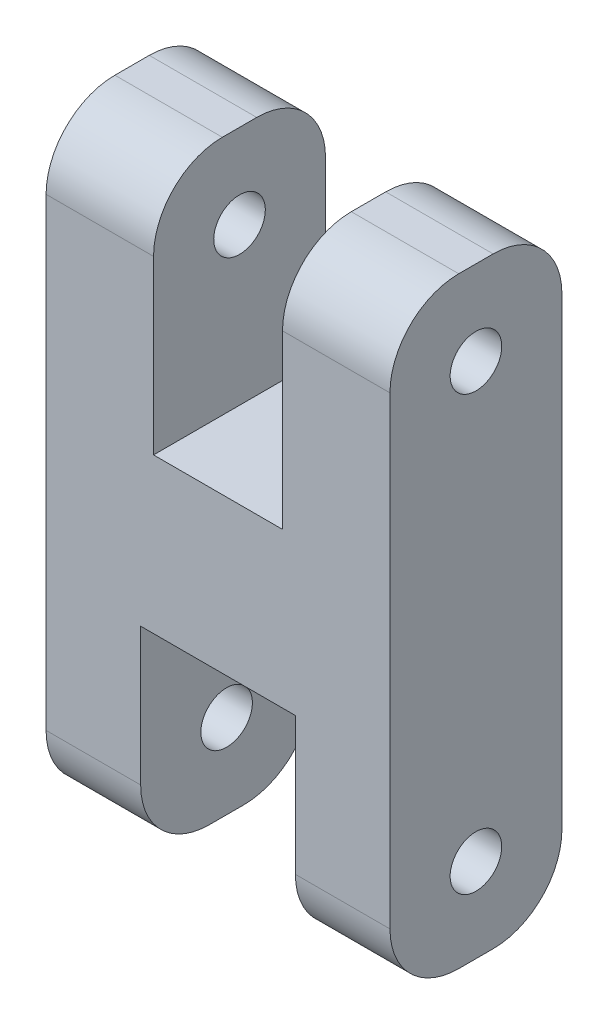
ISO-10303-21;
HEADER;
FILE_DESCRIPTION(('STEP AP214'),'2;1');
FILE_NAME('part.step','',(''),(''),'','','');
FILE_SCHEMA(('AUTOMOTIVE_DESIGN { 1 0 10303 214 1 1 1 1 }'));
ENDSEC;
DATA;
#1=APPLICATION_CONTEXT('core data for automotive mechanical design processes');
#2=APPLICATION_PROTOCOL_DEFINITION('international standard','automotive_design',2000,#1);
#3=PRODUCT_CONTEXT('',#1,'mechanical');
#4=PRODUCT('Part','Part','',(#3));
#5=PRODUCT_RELATED_PRODUCT_CATEGORY('part','',(#4));
#6=PRODUCT_DEFINITION_FORMATION('','',#4);
#7=PRODUCT_DEFINITION_CONTEXT('part definition',#1,'design');
#8=PRODUCT_DEFINITION('design','',#6,#7);
#9=PRODUCT_DEFINITION_SHAPE('','',#8);
#10=(LENGTH_UNIT() NAMED_UNIT(*) SI_UNIT(.MILLI.,.METRE.));
#11=(NAMED_UNIT(*) PLANE_ANGLE_UNIT() SI_UNIT($,.RADIAN.));
#12=(NAMED_UNIT(*) SI_UNIT($,.STERADIAN.) SOLID_ANGLE_UNIT());
#13=UNCERTAINTY_MEASURE_WITH_UNIT(LENGTH_MEASURE(1.E-05),#10,'distance_accuracy_value','');
#14=(GEOMETRIC_REPRESENTATION_CONTEXT(3) GLOBAL_UNCERTAINTY_ASSIGNED_CONTEXT((#13)) GLOBAL_UNIT_ASSIGNED_CONTEXT((#10,
#11,#12)) REPRESENTATION_CONTEXT('',''));
#15=CARTESIAN_POINT('',(0.,0.,0.));
#16=DIRECTION('',(0.,0.,1.));
#17=DIRECTION('',(1.,0.,0.));
#18=AXIS2_PLACEMENT_3D('',#15,#16,#17);
#19=CARTESIAN_POINT('',(10.,-13.5,1.));
#20=DIRECTION('',(-1.,0.,0.));
#21=DIRECTION('',(0.,0.,1.));
#22=AXIS2_PLACEMENT_3D('',#19,#20,#21);
#23=CYLINDRICAL_SURFACE('',#22,4.);
#24=DIRECTION('',(-1.,0.,0.));
#25=VECTOR('',#24,1.);
#26=CARTESIAN_POINT('',(10.,-17.5,1.));
#27=LINE('',#26,#25);
#28=CARTESIAN_POINT('',(-4.49999999999999,-17.5,1.));
#29=VERTEX_POINT('',#28);
#30=CARTESIAN_POINT('',(-10.,-17.5,1.));
#31=VERTEX_POINT('',#30);
#32=EDGE_CURVE('E42',#29,#31,#27,.T.);
#33=ORIENTED_EDGE('',*,*,#32,.F.);
#34=CARTESIAN_POINT('',(-4.49999999999999,-13.5,1.));
#35=DIRECTION('',(-1.,0.,0.));
#36=DIRECTION('',(0.,0.,1.));
#37=AXIS2_PLACEMENT_3D('',#34,#35,#36);
#38=CIRCLE('',#37,4.);
#39=CARTESIAN_POINT('',(-4.49999999999999,-13.5,5.));
#40=VERTEX_POINT('',#39);
#41=EDGE_CURVE('E241',#29,#40,#38,.T.);
#42=ORIENTED_EDGE('',*,*,#41,.T.);
#43=DIRECTION('',(-1.,0.,0.));
#44=VECTOR('',#43,1.);
#45=CARTESIAN_POINT('',(10.,-13.5,5.));
#46=LINE('',#45,#44);
#47=CARTESIAN_POINT('',(-10.,-13.5,5.));
#48=VERTEX_POINT('',#47);
#49=EDGE_CURVE('E286',#40,#48,#46,.T.);
#50=ORIENTED_EDGE('',*,*,#49,.T.);
#51=CARTESIAN_POINT('',(-10.,-13.5,1.));
#52=DIRECTION('',(1.,0.,0.));
#53=DIRECTION('',(0.,0.,-1.));
#54=AXIS2_PLACEMENT_3D('',#51,#52,#53);
#55=CIRCLE('',#54,4.);
#56=EDGE_CURVE('E265',#48,#31,#55,.T.);
#57=ORIENTED_EDGE('',*,*,#56,.T.);
#58=EDGE_LOOP('',(#33,#42,#50,#57));
#59=FACE_BOUND('',#58,.T.);
#60=ADVANCED_FACE('F33',(#59),#23,.T.);
#61=CARTESIAN_POINT('',(10.,-17.5,1.));
#62=DIRECTION('',(0.,1.,0.));
#63=DIRECTION('',(0.,0.,1.));
#64=AXIS2_PLACEMENT_3D('',#61,#62,#63);
#65=PLANE('',#64);
#66=DIRECTION('',(-1.,0.,0.));
#67=VECTOR('',#66,1.);
#68=CARTESIAN_POINT('',(10.,-17.5,-0.999999999999998));
#69=LINE('',#68,#67);
#70=CARTESIAN_POINT('',(-4.49999999999999,-17.5,-0.999999999999999));
#71=VERTEX_POINT('',#70);
#72=CARTESIAN_POINT('',(-10.,-17.5,-0.999999999999998));
#73=VERTEX_POINT('',#72);
#74=EDGE_CURVE('E331',#71,#73,#69,.T.);
#75=ORIENTED_EDGE('',*,*,#74,.F.);
#76=DIRECTION('',(0.,0.,1.));
#77=VECTOR('',#76,1.);
#78=CARTESIAN_POINT('',(-4.49999999999999,-17.5,-5.));
#79=LINE('',#78,#77);
#80=EDGE_CURVE('E224',#71,#29,#79,.T.);
#81=ORIENTED_EDGE('',*,*,#80,.T.);
#82=ORIENTED_EDGE('',*,*,#32,.T.);
#83=DIRECTION('',(0.,0.,-1.));
#84=VECTOR('',#83,1.);
#85=CARTESIAN_POINT('',(-10.,-17.5,1.));
#86=LINE('',#85,#84);
#87=EDGE_CURVE('E289',#31,#73,#86,.T.);
#88=ORIENTED_EDGE('',*,*,#87,.T.);
#89=EDGE_LOOP('',(#75,#81,#82,#88));
#90=FACE_BOUND('',#89,.T.);
#91=ADVANCED_FACE('F376',(#90),#65,.F.);
#92=CARTESIAN_POINT('',(10.,-13.5,-0.999999999999999));
#93=DIRECTION('',(-1.,0.,0.));
#94=DIRECTION('',(0.,0.,1.));
#95=AXIS2_PLACEMENT_3D('',#92,#93,#94);
#96=CYLINDRICAL_SURFACE('',#95,4.);
#97=DIRECTION('',(-1.,0.,0.));
#98=VECTOR('',#97,1.);
#99=CARTESIAN_POINT('',(10.,-13.5,-5.));
#100=LINE('',#99,#98);
#101=CARTESIAN_POINT('',(-4.49999999999999,-13.5,-5.));
#102=VERTEX_POINT('',#101);
#103=CARTESIAN_POINT('',(-10.,-13.5,-5.));
#104=VERTEX_POINT('',#103);
#105=EDGE_CURVE('E327',#102,#104,#100,.T.);
#106=ORIENTED_EDGE('',*,*,#105,.F.);
#107=CARTESIAN_POINT('',(-4.49999999999999,-13.5,-0.999999999999999));
#108=DIRECTION('',(-1.,0.,0.));
#109=DIRECTION('',(0.,0.,1.));
#110=AXIS2_PLACEMENT_3D('',#107,#108,#109);
#111=CIRCLE('',#110,4.);
#112=EDGE_CURVE('E238',#102,#71,#111,.T.);
#113=ORIENTED_EDGE('',*,*,#112,.T.);
#114=ORIENTED_EDGE('',*,*,#74,.T.);
#115=CARTESIAN_POINT('',(-10.,-13.5,-0.999999999999999));
#116=DIRECTION('',(1.,0.,0.));
#117=DIRECTION('',(0.,0.,-1.));
#118=AXIS2_PLACEMENT_3D('',#115,#116,#117);
#119=CIRCLE('',#118,4.);
#120=EDGE_CURVE('E292',#73,#104,#119,.T.);
#121=ORIENTED_EDGE('',*,*,#120,.T.);
#122=EDGE_LOOP('',(#106,#113,#114,#121));
#123=FACE_BOUND('',#122,.T.);
#124=ADVANCED_FACE('F381',(#123),#96,.T.);
#125=CARTESIAN_POINT('',(10.,13.5,-0.999999999999999));
#126=DIRECTION('',(-1.,0.,0.));
#127=DIRECTION('',(0.,0.,1.));
#128=AXIS2_PLACEMENT_3D('',#125,#126,#127);
#129=CYLINDRICAL_SURFACE('',#128,4.);
#130=DIRECTION('',(-1.,0.,0.));
#131=VECTOR('',#130,1.);
#132=CARTESIAN_POINT('',(10.,13.5,-5.));
#133=LINE('',#132,#131);
#134=CARTESIAN_POINT('',(10.,13.5,-5.));
#135=VERTEX_POINT('',#134);
#136=CARTESIAN_POINT('',(3.75,13.5,-5.));
#137=VERTEX_POINT('',#136);
#138=EDGE_CURVE('E324',#135,#137,#133,.T.);
#139=ORIENTED_EDGE('',*,*,#138,.T.);
#140=CARTESIAN_POINT('',(3.75,13.5,-0.999999999999999));
#141=DIRECTION('',(1.,0.,0.));
#142=DIRECTION('',(0.,1.,0.));
#143=AXIS2_PLACEMENT_3D('',#140,#141,#142);
#144=CIRCLE('',#143,4.);
#145=CARTESIAN_POINT('',(3.75,17.5,-0.999999999999998));
#146=VERTEX_POINT('',#145);
#147=EDGE_CURVE('E252',#137,#146,#144,.T.);
#148=ORIENTED_EDGE('',*,*,#147,.T.);
#149=DIRECTION('',(-1.,0.,0.));
#150=VECTOR('',#149,1.);
#151=CARTESIAN_POINT('',(10.,17.5,-0.999999999999999));
#152=LINE('',#151,#150);
#153=CARTESIAN_POINT('',(10.,17.5,-0.999999999999999));
#154=VERTEX_POINT('',#153);
#155=EDGE_CURVE('E320',#154,#146,#152,.T.);
#156=ORIENTED_EDGE('',*,*,#155,.F.);
#157=CARTESIAN_POINT('',(10.,13.5,-0.999999999999999));
#158=DIRECTION('',(1.,0.,0.));
#159=DIRECTION('',(0.,0.,1.));
#160=AXIS2_PLACEMENT_3D('',#157,#158,#159);
#161=CIRCLE('',#160,4.);
#162=EDGE_CURVE('E278',#135,#154,#161,.T.);
#163=ORIENTED_EDGE('',*,*,#162,.F.);
#164=EDGE_LOOP('',(#139,#148,#156,#163));
#165=FACE_BOUND('',#164,.T.);
#166=ADVANCED_FACE('F426',(#165),#129,.T.);
#167=CARTESIAN_POINT('',(10.,17.5,1.));
#168=DIRECTION('',(0.,-1.,0.));
#169=DIRECTION('',(0.,0.,-1.));
#170=AXIS2_PLACEMENT_3D('',#167,#168,#169);
#171=PLANE('',#170);
#172=ORIENTED_EDGE('',*,*,#155,.T.);
#173=DIRECTION('',(0.,0.,1.));
#174=VECTOR('',#173,1.);
#175=CARTESIAN_POINT('',(3.75,17.5,-5.));
#176=LINE('',#175,#174);
#177=CARTESIAN_POINT('',(3.75,17.5,1.));
#178=VERTEX_POINT('',#177);
#179=EDGE_CURVE('E202',#146,#178,#176,.T.);
#180=ORIENTED_EDGE('',*,*,#179,.T.);
#181=DIRECTION('',(-1.,0.,0.));
#182=VECTOR('',#181,1.);
#183=CARTESIAN_POINT('',(10.,17.5,1.));
#184=LINE('',#183,#182);
#185=CARTESIAN_POINT('',(10.,17.5,1.));
#186=VERTEX_POINT('',#185);
#187=EDGE_CURVE('E316',#186,#178,#184,.T.);
#188=ORIENTED_EDGE('',*,*,#187,.F.);
#189=DIRECTION('',(0.,0.,1.));
#190=VECTOR('',#189,1.);
#191=CARTESIAN_POINT('',(10.,17.5,1.));
#192=LINE('',#191,#190);
#193=EDGE_CURVE('E280',#154,#186,#192,.T.);
#194=ORIENTED_EDGE('',*,*,#193,.F.);
#195=EDGE_LOOP('',(#172,#180,#188,#194));
#196=FACE_BOUND('',#195,.T.);
#197=ADVANCED_FACE('F422',(#196),#171,.F.);
#198=CARTESIAN_POINT('',(10.,13.5,1.));
#199=DIRECTION('',(-1.,0.,0.));
#200=DIRECTION('',(0.,0.,1.));
#201=AXIS2_PLACEMENT_3D('',#198,#199,#200);
#202=CYLINDRICAL_SURFACE('',#201,4.);
#203=ORIENTED_EDGE('',*,*,#187,.T.);
#204=CARTESIAN_POINT('',(3.75,13.5,1.));
#205=DIRECTION('',(1.,0.,0.));
#206=DIRECTION('',(0.,1.,0.));
#207=AXIS2_PLACEMENT_3D('',#204,#205,#206);
#208=CIRCLE('',#207,4.);
#209=CARTESIAN_POINT('',(3.75,13.5,5.));
#210=VERTEX_POINT('',#209);
#211=EDGE_CURVE('E249',#178,#210,#208,.T.);
#212=ORIENTED_EDGE('',*,*,#211,.T.);
#213=DIRECTION('',(-1.,0.,0.));
#214=VECTOR('',#213,1.);
#215=CARTESIAN_POINT('',(10.,13.5,5.));
#216=LINE('',#215,#214);
#217=CARTESIAN_POINT('',(10.,13.5,5.));
#218=VERTEX_POINT('',#217);
#219=EDGE_CURVE('E313',#218,#210,#216,.T.);
#220=ORIENTED_EDGE('',*,*,#219,.F.);
#221=CARTESIAN_POINT('',(10.,13.5,1.));
#222=DIRECTION('',(1.,0.,0.));
#223=DIRECTION('',(0.,0.,-1.));
#224=AXIS2_PLACEMENT_3D('',#221,#222,#223);
#225=CIRCLE('',#224,4.);
#226=EDGE_CURVE('E282',#186,#218,#225,.T.);
#227=ORIENTED_EDGE('',*,*,#226,.F.);
#228=EDGE_LOOP('',(#203,#212,#220,#227));
#229=FACE_BOUND('',#228,.T.);
#230=ADVANCED_FACE('F368',(#229),#202,.T.);
#231=CARTESIAN_POINT('',(10.,12.6,0.));
#232=DIRECTION('',(-1.,0.,0.));
#233=DIRECTION('',(0.,0.,1.));
#234=AXIS2_PLACEMENT_3D('',#231,#232,#233);
#235=CYLINDRICAL_SURFACE('',#234,1.5);
#236=CARTESIAN_POINT('',(3.75,12.6,0.));
#237=DIRECTION('',(1.,0.,0.));
#238=DIRECTION('',(0.,1.,0.));
#239=AXIS2_PLACEMENT_3D('',#236,#237,#238);
#240=CIRCLE('',#239,1.5);
#241=CARTESIAN_POINT('',(3.75,14.1,0.));
#242=VERTEX_POINT('',#241);
#243=EDGE_CURVE('E37',#242,#242,#240,.T.);
#244=ORIENTED_EDGE('',*,*,#243,.F.);
#245=EDGE_LOOP('',(#244));
#246=FACE_BOUND('',#245,.T.);
#247=CARTESIAN_POINT('',(10.,12.6,0.));
#248=DIRECTION('',(1.,0.,0.));
#249=DIRECTION('',(0.,0.,-1.));
#250=AXIS2_PLACEMENT_3D('',#247,#248,#249);
#251=CIRCLE('',#250,1.5);
#252=CARTESIAN_POINT('',(10.,12.6,-1.5));
#253=VERTEX_POINT('',#252);
#254=EDGE_CURVE('E262',#253,#253,#251,.T.);
#255=ORIENTED_EDGE('',*,*,#254,.T.);
#256=EDGE_LOOP('',(#255));
#257=FACE_BOUND('',#256,.T.);
#258=ADVANCED_FACE('F347',(#246,#257),#235,.F.);
#259=CARTESIAN_POINT('',(10.,-12.6,0.));
#260=DIRECTION('',(-1.,0.,0.));
#261=DIRECTION('',(0.,0.,1.));
#262=AXIS2_PLACEMENT_3D('',#259,#260,#261);
#263=CYLINDRICAL_SURFACE('',#262,1.5);
#264=CARTESIAN_POINT('',(-4.49999999999999,-12.6,0.));
#265=DIRECTION('',(-1.,0.,0.));
#266=DIRECTION('',(0.,0.,1.));
#267=AXIS2_PLACEMENT_3D('',#264,#265,#266);
#268=CIRCLE('',#267,1.5);
#269=CARTESIAN_POINT('',(-4.49999999999999,-12.6,1.5));
#270=VERTEX_POINT('',#269);
#271=EDGE_CURVE('E237',#270,#270,#268,.T.);
#272=ORIENTED_EDGE('',*,*,#271,.F.);
#273=EDGE_LOOP('',(#272));
#274=FACE_BOUND('',#273,.T.);
#275=CARTESIAN_POINT('',(-10.,-12.6,0.));
#276=DIRECTION('',(1.,0.,0.));
#277=DIRECTION('',(0.,0.,-1.));
#278=AXIS2_PLACEMENT_3D('',#275,#276,#277);
#279=CIRCLE('',#278,1.5);
#280=CARTESIAN_POINT('',(-10.,-12.6,-1.5));
#281=VERTEX_POINT('',#280);
#282=EDGE_CURVE('E255',#281,#281,#279,.T.);
#283=ORIENTED_EDGE('',*,*,#282,.F.);
#284=EDGE_LOOP('',(#283));
#285=FACE_BOUND('',#284,.T.);
#286=ADVANCED_FACE('F358',(#274,#285),#263,.F.);
#287=CARTESIAN_POINT('',(10.,-13.5,1.));
#288=DIRECTION('',(1.,0.,0.));
#289=DIRECTION('',(0.,0.,-1.));
#290=AXIS2_PLACEMENT_3D('',#287,#288,#289);
#291=PLANE('',#290);
#292=ORIENTED_EDGE('',*,*,#254,.F.);
#293=EDGE_LOOP('',(#292));
#294=FACE_BOUND('',#293,.T.);
#295=CARTESIAN_POINT('',(10.,-13.5,1.));
#296=DIRECTION('',(1.,0.,0.));
#297=DIRECTION('',(0.,0.,-1.));
#298=AXIS2_PLACEMENT_3D('',#295,#296,#297);
#299=CIRCLE('',#298,4.);
#300=CARTESIAN_POINT('',(10.,-13.5,5.));
#301=VERTEX_POINT('',#300);
#302=CARTESIAN_POINT('',(10.,-17.5,1.));
#303=VERTEX_POINT('',#302);
#304=EDGE_CURVE('E268',#301,#303,#299,.T.);
#305=ORIENTED_EDGE('',*,*,#304,.T.);
#306=DIRECTION('',(0.,0.,-1.));
#307=VECTOR('',#306,1.);
#308=CARTESIAN_POINT('',(10.,-17.5,1.));
#309=LINE('',#308,#307);
#310=CARTESIAN_POINT('',(10.,-17.5,-0.999999999999998));
#311=VERTEX_POINT('',#310);
#312=EDGE_CURVE('E271',#303,#311,#309,.T.);
#313=ORIENTED_EDGE('',*,*,#312,.T.);
#314=CARTESIAN_POINT('',(10.,-13.5,-0.999999999999999));
#315=DIRECTION('',(1.,0.,0.));
#316=DIRECTION('',(0.,0.,-1.));
#317=AXIS2_PLACEMENT_3D('',#314,#315,#316);
#318=CIRCLE('',#317,4.);
#319=CARTESIAN_POINT('',(10.,-13.5,-5.));
#320=VERTEX_POINT('',#319);
#321=EDGE_CURVE('E274',#311,#320,#318,.T.);
#322=ORIENTED_EDGE('',*,*,#321,.T.);
#323=DIRECTION('',(0.,1.,0.));
#324=VECTOR('',#323,1.);
#325=CARTESIAN_POINT('',(10.,13.5,-5.));
#326=LINE('',#325,#324);
#327=EDGE_CURVE('E276',#320,#135,#326,.T.);
#328=ORIENTED_EDGE('',*,*,#327,.T.);
#329=ORIENTED_EDGE('',*,*,#162,.T.);
#330=ORIENTED_EDGE('',*,*,#193,.T.);
#331=ORIENTED_EDGE('',*,*,#226,.T.);
#332=DIRECTION('',(0.,-1.,0.));
#333=VECTOR('',#332,1.);
#334=CARTESIAN_POINT('',(10.,13.5,5.));
#335=LINE('',#334,#333);
#336=EDGE_CURVE('E284',#218,#301,#335,.T.);
#337=ORIENTED_EDGE('',*,*,#336,.T.);
#338=EDGE_LOOP('',(#305,#313,#322,#328,#329,#330,#331,#337));
#339=FACE_BOUND('',#338,.T.);
#340=CARTESIAN_POINT('',(10.,-12.6,0.));
#341=DIRECTION('',(1.,0.,0.));
#342=DIRECTION('',(0.,0.,-1.));
#343=AXIS2_PLACEMENT_3D('',#340,#341,#342);
#344=CIRCLE('',#343,1.5);
#345=CARTESIAN_POINT('',(10.,-12.6,-1.5));
#346=VERTEX_POINT('',#345);
#347=EDGE_CURVE('E256',#346,#346,#344,.T.);
#348=ORIENTED_EDGE('',*,*,#347,.F.);
#349=EDGE_LOOP('',(#348));
#350=FACE_BOUND('',#349,.T.);
#351=ADVANCED_FACE('F353',(#294,#339,#350),#291,.T.);
#352=CARTESIAN_POINT('',(-10.,-13.5,1.));
#353=DIRECTION('',(1.,0.,0.));
#354=DIRECTION('',(0.,0.,-1.));
#355=AXIS2_PLACEMENT_3D('',#352,#353,#354);
#356=PLANE('',#355);
#357=ORIENTED_EDGE('',*,*,#56,.F.);
#358=DIRECTION('',(0.,-1.,0.));
#359=VECTOR('',#358,1.);
#360=CARTESIAN_POINT('',(-10.,13.5,5.));
#361=LINE('',#360,#359);
#362=CARTESIAN_POINT('',(-10.,13.5,5.));
#363=VERTEX_POINT('',#362);
#364=EDGE_CURVE('E272',#363,#48,#361,.T.);
#365=ORIENTED_EDGE('',*,*,#364,.F.);
#366=CARTESIAN_POINT('',(-10.,13.5,1.));
#367=DIRECTION('',(1.,0.,0.));
#368=DIRECTION('',(0.,0.,-1.));
#369=AXIS2_PLACEMENT_3D('',#366,#367,#368);
#370=CIRCLE('',#369,4.);
#371=CARTESIAN_POINT('',(-10.,17.5,1.));
#372=VERTEX_POINT('',#371);
#373=EDGE_CURVE('E304',#372,#363,#370,.T.);
#374=ORIENTED_EDGE('',*,*,#373,.F.);
#375=DIRECTION('',(0.,0.,1.));
#376=VECTOR('',#375,1.);
#377=CARTESIAN_POINT('',(-10.,17.5,1.));
#378=LINE('',#377,#376);
#379=CARTESIAN_POINT('',(-10.,17.5,-0.999999999999999));
#380=VERTEX_POINT('',#379);
#381=EDGE_CURVE('E301',#380,#372,#378,.T.);
#382=ORIENTED_EDGE('',*,*,#381,.F.);
#383=CARTESIAN_POINT('',(-10.,13.5,-0.999999999999999));
#384=DIRECTION('',(1.,0.,0.));
#385=DIRECTION('',(0.,0.,1.));
#386=AXIS2_PLACEMENT_3D('',#383,#384,#385);
#387=CIRCLE('',#386,4.);
#388=CARTESIAN_POINT('',(-10.,13.5,-5.));
#389=VERTEX_POINT('',#388);
#390=EDGE_CURVE('E298',#389,#380,#387,.T.);
#391=ORIENTED_EDGE('',*,*,#390,.F.);
#392=DIRECTION('',(0.,1.,0.));
#393=VECTOR('',#392,1.);
#394=CARTESIAN_POINT('',(-10.,13.5,-5.));
#395=LINE('',#394,#393);
#396=EDGE_CURVE('E295',#104,#389,#395,.T.);
#397=ORIENTED_EDGE('',*,*,#396,.F.);
#398=ORIENTED_EDGE('',*,*,#120,.F.);
#399=ORIENTED_EDGE('',*,*,#87,.F.);
#400=EDGE_LOOP('',(#357,#365,#374,#382,#391,#397,#398,#399));
#401=FACE_BOUND('',#400,.T.);
#402=CARTESIAN_POINT('',(-10.,12.6,0.));
#403=DIRECTION('',(1.,0.,0.));
#404=DIRECTION('',(0.,0.,-1.));
#405=AXIS2_PLACEMENT_3D('',#402,#403,#404);
#406=CIRCLE('',#405,1.5);
#407=CARTESIAN_POINT('',(-10.,12.6,-1.5));
#408=VERTEX_POINT('',#407);
#409=EDGE_CURVE('E259',#408,#408,#406,.T.);
#410=ORIENTED_EDGE('',*,*,#409,.T.);
#411=EDGE_LOOP('',(#410));
#412=FACE_BOUND('',#411,.T.);
#413=ORIENTED_EDGE('',*,*,#282,.T.);
#414=EDGE_LOOP('',(#413));
#415=FACE_BOUND('',#414,.T.);
#416=ADVANCED_FACE('F350',(#401,#412,#415),#356,.F.);
#417=CARTESIAN_POINT('',(4.5,-13.5,5.));
#418=VERTEX_POINT('',#417);
#419=EDGE_CURVE('E309',#301,#418,#46,.T.);
#420=ORIENTED_EDGE('',*,*,#419,.T.);
#421=CARTESIAN_POINT('',(4.5,-13.5,1.));
#422=DIRECTION('',(1.,0.,0.));
#423=DIRECTION('',(0.,1.,0.));
#424=AXIS2_PLACEMENT_3D('',#421,#422,#423);
#425=CIRCLE('',#424,4.);
#426=CARTESIAN_POINT('',(4.49999999999999,-17.5,1.));
#427=VERTEX_POINT('',#426);
#428=EDGE_CURVE('E58',#418,#427,#425,.T.);
#429=ORIENTED_EDGE('',*,*,#428,.T.);
#430=EDGE_CURVE('E11',#303,#427,#27,.T.);
#431=ORIENTED_EDGE('',*,*,#430,.F.);
#432=ORIENTED_EDGE('',*,*,#304,.F.);
#433=EDGE_LOOP('',(#420,#429,#431,#432));
#434=FACE_BOUND('',#433,.T.);
#435=ADVANCED_FACE('F35',(#434),#23,.T.);
#436=ORIENTED_EDGE('',*,*,#430,.T.);
#437=DIRECTION('',(0.,0.,1.));
#438=VECTOR('',#437,1.);
#439=CARTESIAN_POINT('',(4.49999999999999,-17.5,-5.));
#440=LINE('',#439,#438);
#441=CARTESIAN_POINT('',(4.49999999999999,-17.5,-0.999999999999999));
#442=VERTEX_POINT('',#441);
#443=EDGE_CURVE('E229',#442,#427,#440,.T.);
#444=ORIENTED_EDGE('',*,*,#443,.F.);
#445=EDGE_CURVE('E332',#311,#442,#69,.T.);
#446=ORIENTED_EDGE('',*,*,#445,.F.);
#447=ORIENTED_EDGE('',*,*,#312,.F.);
#448=EDGE_LOOP('',(#436,#444,#446,#447));
#449=FACE_BOUND('',#448,.T.);
#450=ADVANCED_FACE('F383',(#449),#65,.F.);
#451=ORIENTED_EDGE('',*,*,#445,.T.);
#452=CARTESIAN_POINT('',(4.5,-13.5,-0.999999999999999));
#453=DIRECTION('',(1.,0.,0.));
#454=DIRECTION('',(0.,1.,0.));
#455=AXIS2_PLACEMENT_3D('',#452,#453,#454);
#456=CIRCLE('',#455,4.);
#457=CARTESIAN_POINT('',(4.5,-13.5,-5.));
#458=VERTEX_POINT('',#457);
#459=EDGE_CURVE('E233',#442,#458,#456,.T.);
#460=ORIENTED_EDGE('',*,*,#459,.T.);
#461=EDGE_CURVE('E328',#320,#458,#100,.T.);
#462=ORIENTED_EDGE('',*,*,#461,.F.);
#463=ORIENTED_EDGE('',*,*,#321,.F.);
#464=EDGE_LOOP('',(#451,#460,#462,#463));
#465=FACE_BOUND('',#464,.T.);
#466=ADVANCED_FACE('F390',(#465),#96,.T.);
#467=CARTESIAN_POINT('',(10.,13.5,-5.));
#468=DIRECTION('',(0.,0.,1.));
#469=DIRECTION('',(1.,0.,0.));
#470=AXIS2_PLACEMENT_3D('',#467,#468,#469);
#471=PLANE('',#470);
#472=DIRECTION('',(1.,0.,0.));
#473=VECTOR('',#472,1.);
#474=CARTESIAN_POINT('',(-3.75,3.5,-5.));
#475=LINE('',#474,#473);
#476=CARTESIAN_POINT('',(-3.75,3.5,-5.));
#477=VERTEX_POINT('',#476);
#478=CARTESIAN_POINT('',(3.75,3.5,-5.));
#479=VERTEX_POINT('',#478);
#480=EDGE_CURVE('E185',#477,#479,#475,.T.);
#481=ORIENTED_EDGE('',*,*,#480,.T.);
#482=DIRECTION('',(0.,1.,0.));
#483=VECTOR('',#482,1.);
#484=CARTESIAN_POINT('',(3.75,17.5,-5.));
#485=LINE('',#484,#483);
#486=EDGE_CURVE('E199',#479,#137,#485,.T.);
#487=ORIENTED_EDGE('',*,*,#486,.T.);
#488=ORIENTED_EDGE('',*,*,#138,.F.);
#489=ORIENTED_EDGE('',*,*,#327,.F.);
#490=ORIENTED_EDGE('',*,*,#461,.T.);
#491=DIRECTION('',(0.,1.,0.));
#492=VECTOR('',#491,1.);
#493=CARTESIAN_POINT('',(4.49999999999999,-17.5,-5.));
#494=LINE('',#493,#492);
#495=CARTESIAN_POINT('',(4.50000000000001,-5.50000000000001,-5.));
#496=VERTEX_POINT('',#495);
#497=EDGE_CURVE('E218',#458,#496,#494,.T.);
#498=ORIENTED_EDGE('',*,*,#497,.T.);
#499=DIRECTION('',(-1.,0.,0.));
#500=VECTOR('',#499,1.);
#501=CARTESIAN_POINT('',(-4.49999999999999,-5.50000000000001,-5.));
#502=LINE('',#501,#500);
#503=CARTESIAN_POINT('',(-4.49999999999999,-5.50000000000001,-5.));
#504=VERTEX_POINT('',#503);
#505=EDGE_CURVE('E221',#496,#504,#502,.T.);
#506=ORIENTED_EDGE('',*,*,#505,.T.);
#507=DIRECTION('',(0.,-1.,0.));
#508=VECTOR('',#507,1.);
#509=CARTESIAN_POINT('',(-4.49999999999999,-17.5,-5.));
#510=LINE('',#509,#508);
#511=EDGE_CURVE('E215',#504,#102,#510,.T.);
#512=ORIENTED_EDGE('',*,*,#511,.T.);
#513=ORIENTED_EDGE('',*,*,#105,.T.);
#514=ORIENTED_EDGE('',*,*,#396,.T.);
#515=CARTESIAN_POINT('',(-3.75,13.5,-5.));
#516=VERTEX_POINT('',#515);
#517=EDGE_CURVE('E323',#516,#389,#133,.T.);
#518=ORIENTED_EDGE('',*,*,#517,.F.);
#519=DIRECTION('',(0.,-1.,0.));
#520=VECTOR('',#519,1.);
#521=CARTESIAN_POINT('',(-3.75,17.5,-5.));
#522=LINE('',#521,#520);
#523=EDGE_CURVE('E194',#516,#477,#522,.T.);
#524=ORIENTED_EDGE('',*,*,#523,.T.);
#525=EDGE_LOOP('',(#481,#487,#488,#489,#490,#498,#506,#512,#513,#514,#518,#524));
#526=FACE_BOUND('',#525,.T.);
#527=ADVANCED_FACE('F404',(#526),#471,.F.);
#528=CARTESIAN_POINT('',(-3.75,17.5,-0.999999999999998));
#529=VERTEX_POINT('',#528);
#530=EDGE_CURVE('E319',#529,#380,#152,.T.);
#531=ORIENTED_EDGE('',*,*,#530,.F.);
#532=CARTESIAN_POINT('',(-3.75,13.5,-0.999999999999999));
#533=DIRECTION('',(-1.,0.,0.));
#534=DIRECTION('',(0.,-1.,0.));
#535=AXIS2_PLACEMENT_3D('',#532,#533,#534);
#536=CIRCLE('',#535,4.);
#537=EDGE_CURVE('E246',#529,#516,#536,.T.);
#538=ORIENTED_EDGE('',*,*,#537,.T.);
#539=ORIENTED_EDGE('',*,*,#517,.T.);
#540=ORIENTED_EDGE('',*,*,#390,.T.);
#541=EDGE_LOOP('',(#531,#538,#539,#540));
#542=FACE_BOUND('',#541,.T.);
#543=ADVANCED_FACE('F432',(#542),#129,.T.);
#544=CARTESIAN_POINT('',(-3.75,17.5,1.));
#545=VERTEX_POINT('',#544);
#546=EDGE_CURVE('E315',#545,#372,#184,.T.);
#547=ORIENTED_EDGE('',*,*,#546,.F.);
#548=DIRECTION('',(0.,0.,1.));
#549=VECTOR('',#548,1.);
#550=CARTESIAN_POINT('',(-3.75,17.5,-5.));
#551=LINE('',#550,#549);
#552=EDGE_CURVE('E188',#529,#545,#551,.T.);
#553=ORIENTED_EDGE('',*,*,#552,.F.);
#554=ORIENTED_EDGE('',*,*,#530,.T.);
#555=ORIENTED_EDGE('',*,*,#381,.T.);
#556=EDGE_LOOP('',(#547,#553,#554,#555));
#557=FACE_BOUND('',#556,.T.);
#558=ADVANCED_FACE('F437',(#557),#171,.F.);
#559=CARTESIAN_POINT('',(-3.75,13.5,5.));
#560=VERTEX_POINT('',#559);
#561=EDGE_CURVE('E312',#560,#363,#216,.T.);
#562=ORIENTED_EDGE('',*,*,#561,.F.);
#563=CARTESIAN_POINT('',(-3.75,13.5,1.));
#564=DIRECTION('',(-1.,0.,0.));
#565=DIRECTION('',(0.,-1.,0.));
#566=AXIS2_PLACEMENT_3D('',#563,#564,#565);
#567=CIRCLE('',#566,4.);
#568=EDGE_CURVE('E50',#560,#545,#567,.T.);
#569=ORIENTED_EDGE('',*,*,#568,.T.);
#570=ORIENTED_EDGE('',*,*,#546,.T.);
#571=ORIENTED_EDGE('',*,*,#373,.T.);
#572=EDGE_LOOP('',(#562,#569,#570,#571));
#573=FACE_BOUND('',#572,.T.);
#574=ADVANCED_FACE('F440',(#573),#202,.T.);
#575=CARTESIAN_POINT('',(10.,13.5,5.));
#576=DIRECTION('',(0.,0.,-1.));
#577=DIRECTION('',(-1.,0.,0.));
#578=AXIS2_PLACEMENT_3D('',#575,#576,#577);
#579=PLANE('',#578);
#580=ORIENTED_EDGE('',*,*,#219,.T.);
#581=DIRECTION('',(0.,1.,0.));
#582=VECTOR('',#581,1.);
#583=CARTESIAN_POINT('',(3.75,17.5,5.));
#584=LINE('',#583,#582);
#585=CARTESIAN_POINT('',(3.75,3.5,5.));
#586=VERTEX_POINT('',#585);
#587=EDGE_CURVE('E192',#586,#210,#584,.T.);
#588=ORIENTED_EDGE('',*,*,#587,.F.);
#589=DIRECTION('',(1.,0.,0.));
#590=VECTOR('',#589,1.);
#591=CARTESIAN_POINT('',(-3.75,3.5,5.));
#592=LINE('',#591,#590);
#593=CARTESIAN_POINT('',(-3.75,3.5,5.));
#594=VERTEX_POINT('',#593);
#595=EDGE_CURVE('E177',#594,#586,#592,.T.);
#596=ORIENTED_EDGE('',*,*,#595,.F.);
#597=DIRECTION('',(0.,-1.,0.));
#598=VECTOR('',#597,1.);
#599=CARTESIAN_POINT('',(-3.75,17.5,5.));
#600=LINE('',#599,#598);
#601=EDGE_CURVE('E169',#560,#594,#600,.T.);
#602=ORIENTED_EDGE('',*,*,#601,.F.);
#603=ORIENTED_EDGE('',*,*,#561,.T.);
#604=ORIENTED_EDGE('',*,*,#364,.T.);
#605=ORIENTED_EDGE('',*,*,#49,.F.);
#606=DIRECTION('',(0.,-1.,0.));
#607=VECTOR('',#606,1.);
#608=CARTESIAN_POINT('',(-4.49999999999999,-17.5,5.));
#609=LINE('',#608,#607);
#610=CARTESIAN_POINT('',(-4.49999999999999,-5.50000000000001,5.));
#611=VERTEX_POINT('',#610);
#612=EDGE_CURVE('E208',#611,#40,#609,.T.);
#613=ORIENTED_EDGE('',*,*,#612,.F.);
#614=DIRECTION('',(-1.,0.,0.));
#615=VECTOR('',#614,1.);
#616=CARTESIAN_POINT('',(-4.49999999999999,-5.50000000000001,5.));
#617=LINE('',#616,#615);
#618=CARTESIAN_POINT('',(4.50000000000001,-5.50000000000001,5.));
#619=VERTEX_POINT('',#618);
#620=EDGE_CURVE('E212',#619,#611,#617,.T.);
#621=ORIENTED_EDGE('',*,*,#620,.F.);
#622=DIRECTION('',(0.,1.,0.));
#623=VECTOR('',#622,1.);
#624=CARTESIAN_POINT('',(4.49999999999999,-17.5,5.));
#625=LINE('',#624,#623);
#626=EDGE_CURVE('E210',#418,#619,#625,.T.);
#627=ORIENTED_EDGE('',*,*,#626,.F.);
#628=ORIENTED_EDGE('',*,*,#419,.F.);
#629=ORIENTED_EDGE('',*,*,#336,.F.);
#630=EDGE_LOOP('',(#580,#588,#596,#602,#603,#604,#605,#613,#621,#627,#628,#629));
#631=FACE_BOUND('',#630,.T.);
#632=ADVANCED_FACE('F191',(#631),#579,.F.);
#633=CARTESIAN_POINT('',(-3.75,12.6,0.));
#634=DIRECTION('',(-1.,0.,0.));
#635=DIRECTION('',(0.,-1.,0.));
#636=AXIS2_PLACEMENT_3D('',#633,#634,#635);
#637=CIRCLE('',#636,1.5);
#638=CARTESIAN_POINT('',(-3.75,11.1,0.));
#639=VERTEX_POINT('',#638);
#640=EDGE_CURVE('E244',#639,#639,#637,.T.);
#641=ORIENTED_EDGE('',*,*,#640,.F.);
#642=EDGE_LOOP('',(#641));
#643=FACE_BOUND('',#642,.T.);
#644=ORIENTED_EDGE('',*,*,#409,.F.);
#645=EDGE_LOOP('',(#644));
#646=FACE_BOUND('',#645,.T.);
#647=ADVANCED_FACE('F342',(#643,#646),#235,.F.);
#648=CARTESIAN_POINT('',(4.5,-12.6,0.));
#649=DIRECTION('',(1.,0.,0.));
#650=DIRECTION('',(0.,1.,0.));
#651=AXIS2_PLACEMENT_3D('',#648,#649,#650);
#652=CIRCLE('',#651,1.5);
#653=CARTESIAN_POINT('',(4.5,-11.1,0.));
#654=VERTEX_POINT('',#653);
#655=EDGE_CURVE('E205',#654,#654,#652,.T.);
#656=ORIENTED_EDGE('',*,*,#655,.F.);
#657=EDGE_LOOP('',(#656));
#658=FACE_BOUND('',#657,.T.);
#659=ORIENTED_EDGE('',*,*,#347,.T.);
#660=EDGE_LOOP('',(#659));
#661=FACE_BOUND('',#660,.T.);
#662=ADVANCED_FACE('F345',(#658,#661),#263,.F.);
#663=CARTESIAN_POINT('',(-4.49999999999999,-17.5,-5.));
#664=DIRECTION('',(-1.,0.,0.));
#665=DIRECTION('',(0.,0.,1.));
#666=AXIS2_PLACEMENT_3D('',#663,#664,#665);
#667=PLANE('',#666);
#668=ORIENTED_EDGE('',*,*,#271,.T.);
#669=EDGE_LOOP('',(#668));
#670=FACE_BOUND('',#669,.T.);
#671=ORIENTED_EDGE('',*,*,#80,.F.);
#672=ORIENTED_EDGE('',*,*,#112,.F.);
#673=ORIENTED_EDGE('',*,*,#511,.F.);
#674=DIRECTION('',(0.,0.,1.));
#675=VECTOR('',#674,1.);
#676=CARTESIAN_POINT('',(-4.49999999999999,-5.50000000000001,-5.));
#677=LINE('',#676,#675);
#678=EDGE_CURVE('E178',#504,#611,#677,.T.);
#679=ORIENTED_EDGE('',*,*,#678,.T.);
#680=ORIENTED_EDGE('',*,*,#612,.T.);
#681=ORIENTED_EDGE('',*,*,#41,.F.);
#682=EDGE_LOOP('',(#671,#672,#673,#679,#680,#681));
#683=FACE_BOUND('',#682,.T.);
#684=ADVANCED_FACE('F373',(#670,#683),#667,.F.);
#685=CARTESIAN_POINT('',(4.49999999999999,-17.5,-5.));
#686=DIRECTION('',(1.,0.,0.));
#687=DIRECTION('',(0.,1.,0.));
#688=AXIS2_PLACEMENT_3D('',#685,#686,#687);
#689=PLANE('',#688);
#690=ORIENTED_EDGE('',*,*,#655,.T.);
#691=EDGE_LOOP('',(#690));
#692=FACE_BOUND('',#691,.T.);
#693=ORIENTED_EDGE('',*,*,#626,.T.);
#694=DIRECTION('',(0.,0.,1.));
#695=VECTOR('',#694,1.);
#696=CARTESIAN_POINT('',(4.50000000000001,-5.50000000000001,-5.));
#697=LINE('',#696,#695);
#698=EDGE_CURVE('E226',#496,#619,#697,.T.);
#699=ORIENTED_EDGE('',*,*,#698,.F.);
#700=ORIENTED_EDGE('',*,*,#497,.F.);
#701=ORIENTED_EDGE('',*,*,#459,.F.);
#702=ORIENTED_EDGE('',*,*,#443,.T.);
#703=ORIENTED_EDGE('',*,*,#428,.F.);
#704=EDGE_LOOP('',(#693,#699,#700,#701,#702,#703));
#705=FACE_BOUND('',#704,.T.);
#706=ADVANCED_FACE('F398',(#692,#705),#689,.F.);
#707=CARTESIAN_POINT('',(-4.49999999999999,-5.50000000000001,-5.));
#708=DIRECTION('',(0.,1.,0.));
#709=DIRECTION('',(0.,0.,1.));
#710=AXIS2_PLACEMENT_3D('',#707,#708,#709);
#711=PLANE('',#710);
#712=ORIENTED_EDGE('',*,*,#678,.F.);
#713=ORIENTED_EDGE('',*,*,#505,.F.);
#714=ORIENTED_EDGE('',*,*,#698,.T.);
#715=ORIENTED_EDGE('',*,*,#620,.T.);
#716=EDGE_LOOP('',(#712,#713,#714,#715));
#717=FACE_BOUND('',#716,.T.);
#718=ADVANCED_FACE('F401',(#717),#711,.F.);
#719=CARTESIAN_POINT('',(3.75,17.5,-5.));
#720=DIRECTION('',(1.,0.,0.));
#721=DIRECTION('',(0.,1.,0.));
#722=AXIS2_PLACEMENT_3D('',#719,#720,#721);
#723=PLANE('',#722);
#724=ORIENTED_EDGE('',*,*,#243,.T.);
#725=EDGE_LOOP('',(#724));
#726=FACE_BOUND('',#725,.T.);
#727=ORIENTED_EDGE('',*,*,#486,.F.);
#728=DIRECTION('',(0.,0.,1.));
#729=VECTOR('',#728,1.);
#730=CARTESIAN_POINT('',(3.75,3.5,-5.));
#731=LINE('',#730,#729);
#732=EDGE_CURVE('E187',#479,#586,#731,.T.);
#733=ORIENTED_EDGE('',*,*,#732,.T.);
#734=ORIENTED_EDGE('',*,*,#587,.T.);
#735=ORIENTED_EDGE('',*,*,#211,.F.);
#736=ORIENTED_EDGE('',*,*,#179,.F.);
#737=ORIENTED_EDGE('',*,*,#147,.F.);
#738=EDGE_LOOP('',(#727,#733,#734,#735,#736,#737));
#739=FACE_BOUND('',#738,.T.);
#740=ADVANCED_FACE('F420',(#726,#739),#723,.F.);
#741=CARTESIAN_POINT('',(-3.75,17.5,-5.));
#742=DIRECTION('',(-1.,0.,0.));
#743=DIRECTION('',(0.,-1.,0.));
#744=AXIS2_PLACEMENT_3D('',#741,#742,#743);
#745=PLANE('',#744);
#746=ORIENTED_EDGE('',*,*,#640,.T.);
#747=EDGE_LOOP('',(#746));
#748=FACE_BOUND('',#747,.T.);
#749=ORIENTED_EDGE('',*,*,#552,.T.);
#750=ORIENTED_EDGE('',*,*,#568,.F.);
#751=ORIENTED_EDGE('',*,*,#601,.T.);
#752=DIRECTION('',(0.,0.,1.));
#753=VECTOR('',#752,1.);
#754=CARTESIAN_POINT('',(-3.75,3.5,-5.));
#755=LINE('',#754,#753);
#756=EDGE_CURVE('E172',#477,#594,#755,.T.);
#757=ORIENTED_EDGE('',*,*,#756,.F.);
#758=ORIENTED_EDGE('',*,*,#523,.F.);
#759=ORIENTED_EDGE('',*,*,#537,.F.);
#760=EDGE_LOOP('',(#749,#750,#751,#757,#758,#759));
#761=FACE_BOUND('',#760,.T.);
#762=ADVANCED_FACE('F171',(#748,#761),#745,.F.);
#763=CARTESIAN_POINT('',(-3.75,3.5,-5.));
#764=DIRECTION('',(0.,-1.,0.));
#765=DIRECTION('',(0.,0.,-1.));
#766=AXIS2_PLACEMENT_3D('',#763,#764,#765);
#767=PLANE('',#766);
#768=ORIENTED_EDGE('',*,*,#732,.F.);
#769=ORIENTED_EDGE('',*,*,#480,.F.);
#770=ORIENTED_EDGE('',*,*,#756,.T.);
#771=ORIENTED_EDGE('',*,*,#595,.T.);
#772=EDGE_LOOP('',(#768,#769,#770,#771));
#773=FACE_BOUND('',#772,.T.);
#774=ADVANCED_FACE('F182',(#773),#767,.F.);
#775=CLOSED_SHELL('',(#60,#91,#124,#166,#197,#230,#258,#286,#351,#416,#435,#450,#466,#527,#543,
#558,#574,#632,#647,#662,#684,#706,#718,#740,#762,#774));
#776=MANIFOLD_SOLID_BREP('B2',#775);
#777=ADVANCED_BREP_SHAPE_REPRESENTATION('',(#18,#776),#14);
#778=SHAPE_DEFINITION_REPRESENTATION(#9,#777);
ENDSEC;
END-ISO-10303-21;
